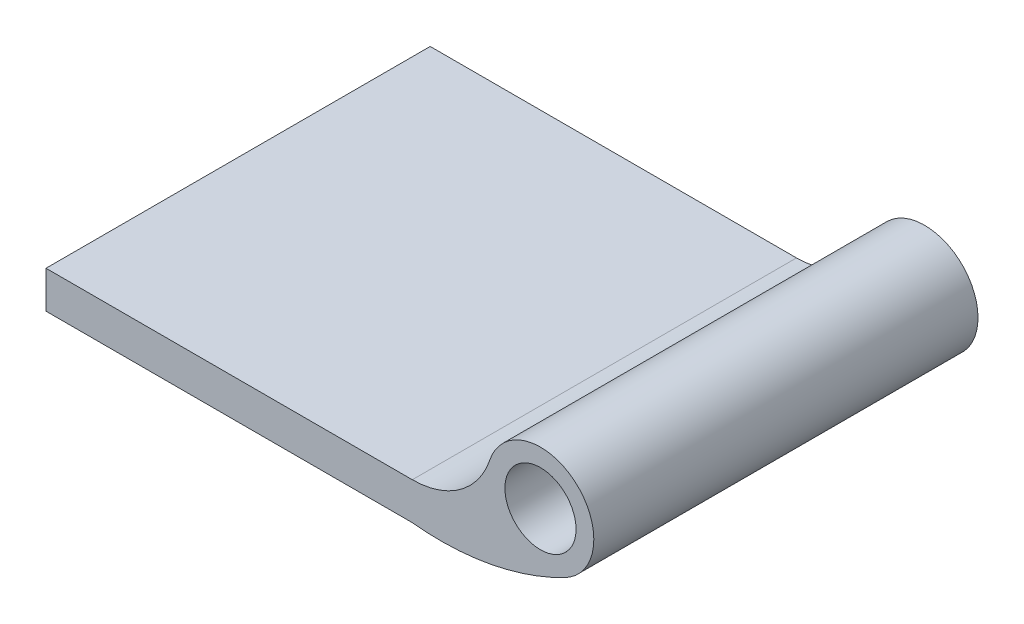
ISO-10303-21;
HEADER;
FILE_DESCRIPTION(('STEP AP214'),'2;1');
FILE_NAME('part.step','',(''),(''),'','','');
FILE_SCHEMA(('AUTOMOTIVE_DESIGN { 1 0 10303 214 1 1 1 1 }'));
ENDSEC;
DATA;
#1=APPLICATION_CONTEXT('core data for automotive mechanical design processes');
#2=APPLICATION_PROTOCOL_DEFINITION('international standard','automotive_design',2000,#1);
#3=PRODUCT_CONTEXT('',#1,'mechanical');
#4=PRODUCT('Part','Part','',(#3));
#5=PRODUCT_RELATED_PRODUCT_CATEGORY('part','',(#4));
#6=PRODUCT_DEFINITION_FORMATION('','',#4);
#7=PRODUCT_DEFINITION_CONTEXT('part definition',#1,'design');
#8=PRODUCT_DEFINITION('design','',#6,#7);
#9=PRODUCT_DEFINITION_SHAPE('','',#8);
#10=(LENGTH_UNIT() NAMED_UNIT(*) SI_UNIT(.MILLI.,.METRE.));
#11=(NAMED_UNIT(*) PLANE_ANGLE_UNIT() SI_UNIT($,.RADIAN.));
#12=(NAMED_UNIT(*) SI_UNIT($,.STERADIAN.) SOLID_ANGLE_UNIT());
#13=UNCERTAINTY_MEASURE_WITH_UNIT(LENGTH_MEASURE(1.E-05),#10,'distance_accuracy_value','');
#14=(GEOMETRIC_REPRESENTATION_CONTEXT(3) GLOBAL_UNCERTAINTY_ASSIGNED_CONTEXT((#13)) GLOBAL_UNIT_ASSIGNED_CONTEXT((#10,
#11,#12)) REPRESENTATION_CONTEXT('',''));
#15=CARTESIAN_POINT('',(0.,0.,0.));
#16=DIRECTION('',(0.,0.,1.));
#17=DIRECTION('',(1.,0.,0.));
#18=AXIS2_PLACEMENT_3D('',#15,#16,#17);
#19=CARTESIAN_POINT('',(0.,-21.4207725533601,108.));
#20=DIRECTION('',(0.,1.,0.));
#21=DIRECTION('',(0.,0.,1.));
#22=AXIS2_PLACEMENT_3D('',#19,#20,#21);
#23=PLANE('',#22);
#24=DIRECTION('',(1.,0.,0.));
#25=VECTOR('',#24,1.);
#26=CARTESIAN_POINT('',(0.,-21.4207725533601,0.));
#27=LINE('',#26,#25);
#28=CARTESIAN_POINT('',(-139.,-21.4207725533601,0.));
#29=VERTEX_POINT('',#28);
#30=CARTESIAN_POINT('',(-36.026336114154,-21.4207725533601,0.));
#31=VERTEX_POINT('',#30);
#32=EDGE_CURVE('E121',#29,#31,#27,.T.);
#33=ORIENTED_EDGE('',*,*,#32,.T.);
#34=DIRECTION('',(0.,0.,-1.));
#35=VECTOR('',#34,1.);
#36=CARTESIAN_POINT('',(-36.026336114154,-21.4207725533601,108.));
#37=LINE('',#36,#35);
#38=CARTESIAN_POINT('',(-36.026336114154,-21.4207725533601,108.));
#39=VERTEX_POINT('',#38);
#40=EDGE_CURVE('E11',#39,#31,#37,.T.);
#41=ORIENTED_EDGE('',*,*,#40,.F.);
#42=DIRECTION('',(1.,0.,0.));
#43=VECTOR('',#42,1.);
#44=CARTESIAN_POINT('',(0.,-21.4207725533601,108.));
#45=LINE('',#44,#43);
#46=CARTESIAN_POINT('',(-139.,-21.4207725533601,108.));
#47=VERTEX_POINT('',#46);
#48=EDGE_CURVE('E81',#47,#39,#45,.T.);
#49=ORIENTED_EDGE('',*,*,#48,.F.);
#50=DIRECTION('',(0.,0.,-1.));
#51=VECTOR('',#50,1.);
#52=CARTESIAN_POINT('',(-139.,-21.4207725533601,108.));
#53=LINE('',#52,#51);
#54=EDGE_CURVE('E50',#47,#29,#53,.T.);
#55=ORIENTED_EDGE('',*,*,#54,.T.);
#56=EDGE_LOOP('',(#33,#41,#49,#55));
#57=FACE_BOUND('',#56,.T.);
#58=ADVANCED_FACE('F34',(#57),#23,.F.);
#59=CARTESIAN_POINT('',(-28.0230008473586,53.9438078672115,108.));
#60=DIRECTION('',(0.,0.,-1.));
#61=DIRECTION('',(-1.,0.,0.));
#62=AXIS2_PLACEMENT_3D('',#59,#60,#61);
#63=CYLINDRICAL_SURFACE('',#62,75.7883457885283);
#64=CARTESIAN_POINT('',(-28.0230008473586,53.9438078672115,0.));
#65=DIRECTION('',(0.,0.,1.));
#66=DIRECTION('',(1.,0.,0.));
#67=AXIS2_PLACEMENT_3D('',#64,#65,#66);
#68=CIRCLE('',#67,75.7883457885283);
#69=CARTESIAN_POINT('',(6.91489474269762,-13.3110567085192,0.));
#70=VERTEX_POINT('',#69);
#71=EDGE_CURVE('E123',#70,#31,#68,.F.);
#72=ORIENTED_EDGE('',*,*,#71,.F.);
#73=DIRECTION('',(0.,0.,-1.));
#74=VECTOR('',#73,1.);
#75=CARTESIAN_POINT('',(6.91489474269762,-13.3110567085192,108.));
#76=LINE('',#75,#74);
#77=CARTESIAN_POINT('',(6.91489474269762,-13.3110567085192,108.));
#78=VERTEX_POINT('',#77);
#79=EDGE_CURVE('E42',#78,#70,#76,.T.);
#80=ORIENTED_EDGE('',*,*,#79,.F.);
#81=CARTESIAN_POINT('',(-28.0230008473586,53.9438078672115,108.));
#82=DIRECTION('',(0.,0.,1.));
#83=DIRECTION('',(1.,0.,0.));
#84=AXIS2_PLACEMENT_3D('',#81,#82,#83);
#85=CIRCLE('',#84,75.7883457885283);
#86=EDGE_CURVE('E149',#78,#39,#85,.F.);
#87=ORIENTED_EDGE('',*,*,#86,.T.);
#88=ORIENTED_EDGE('',*,*,#40,.T.);
#89=EDGE_LOOP('',(#72,#80,#87,#88));
#90=FACE_BOUND('',#89,.T.);
#91=ADVANCED_FACE('F148',(#90),#63,.T.);
#92=CARTESIAN_POINT('',(0.,0.,108.));
#93=DIRECTION('',(0.,0.,-1.));
#94=DIRECTION('',(-1.,0.,0.));
#95=AXIS2_PLACEMENT_3D('',#92,#93,#94);
#96=CYLINDRICAL_SURFACE('',#95,15.);
#97=CARTESIAN_POINT('',(0.,0.,0.));
#98=DIRECTION('',(0.,0.,1.));
#99=DIRECTION('',(1.,0.,0.));
#100=AXIS2_PLACEMENT_3D('',#97,#98,#99);
#101=CIRCLE('',#100,15.);
#102=CARTESIAN_POINT('',(-14.229640925935,4.74524173451217,0.));
#103=VERTEX_POINT('',#102);
#104=EDGE_CURVE('E126',#70,#103,#101,.T.);
#105=ORIENTED_EDGE('',*,*,#104,.T.);
#106=DIRECTION('',(0.,0.,-1.));
#107=VECTOR('',#106,1.);
#108=CARTESIAN_POINT('',(-14.229640925935,4.74524173451217,108.));
#109=LINE('',#108,#107);
#110=CARTESIAN_POINT('',(-14.229640925935,4.74524173451217,108.));
#111=VERTEX_POINT('',#110);
#112=EDGE_CURVE('E110',#111,#103,#109,.T.);
#113=ORIENTED_EDGE('',*,*,#112,.F.);
#114=CARTESIAN_POINT('',(0.,0.,108.));
#115=DIRECTION('',(0.,0.,1.));
#116=DIRECTION('',(1.,0.,0.));
#117=AXIS2_PLACEMENT_3D('',#114,#115,#116);
#118=CIRCLE('',#117,15.);
#119=EDGE_CURVE('E98',#78,#111,#118,.T.);
#120=ORIENTED_EDGE('',*,*,#119,.F.);
#121=ORIENTED_EDGE('',*,*,#79,.T.);
#122=EDGE_LOOP('',(#105,#113,#120,#121));
#123=FACE_BOUND('',#122,.T.);
#124=ADVANCED_FACE('F141',(#123),#96,.T.);
#125=CARTESIAN_POINT('',(-36.026336114154,12.0139133910868,108.));
#126=DIRECTION('',(0.,0.,-1.));
#127=DIRECTION('',(-1.,0.,0.));
#128=AXIS2_PLACEMENT_3D('',#125,#126,#127);
#129=CYLINDRICAL_SURFACE('',#128,22.9767166666437);
#130=CARTESIAN_POINT('',(-36.026336114154,12.0139133910868,0.));
#131=DIRECTION('',(0.,0.,1.));
#132=DIRECTION('',(1.,0.,0.));
#133=AXIS2_PLACEMENT_3D('',#130,#131,#132);
#134=CIRCLE('',#133,22.9767166666437);
#135=CARTESIAN_POINT('',(-36.026336114154,-10.9628032755569,0.));
#136=VERTEX_POINT('',#135);
#137=EDGE_CURVE('E107',#103,#136,#134,.F.);
#138=ORIENTED_EDGE('',*,*,#137,.T.);
#139=DIRECTION('',(0.,0.,-1.));
#140=VECTOR('',#139,1.);
#141=CARTESIAN_POINT('',(-36.026336114154,-10.9628032755569,108.));
#142=LINE('',#141,#140);
#143=CARTESIAN_POINT('',(-36.026336114154,-10.9628032755569,108.));
#144=VERTEX_POINT('',#143);
#145=EDGE_CURVE('E104',#144,#136,#142,.T.);
#146=ORIENTED_EDGE('',*,*,#145,.F.);
#147=CARTESIAN_POINT('',(-36.026336114154,12.0139133910868,108.));
#148=DIRECTION('',(0.,0.,1.));
#149=DIRECTION('',(1.,0.,0.));
#150=AXIS2_PLACEMENT_3D('',#147,#148,#149);
#151=CIRCLE('',#150,22.9767166666437);
#152=EDGE_CURVE('E91',#111,#144,#151,.F.);
#153=ORIENTED_EDGE('',*,*,#152,.F.);
#154=ORIENTED_EDGE('',*,*,#112,.T.);
#155=EDGE_LOOP('',(#138,#146,#153,#154));
#156=FACE_BOUND('',#155,.T.);
#157=ADVANCED_FACE('F105',(#156),#129,.F.);
#158=CARTESIAN_POINT('',(0.,-10.9628032755569,108.));
#159=DIRECTION('',(0.,1.,0.));
#160=DIRECTION('',(-1.,0.,0.));
#161=AXIS2_PLACEMENT_3D('',#158,#159,#160);
#162=PLANE('',#161);
#163=DIRECTION('',(1.,0.,0.));
#164=VECTOR('',#163,1.);
#165=CARTESIAN_POINT('',(0.,-10.9628032755569,0.));
#166=LINE('',#165,#164);
#167=CARTESIAN_POINT('',(-139.,-10.9628032755569,0.));
#168=VERTEX_POINT('',#167);
#169=EDGE_CURVE('E129',#168,#136,#166,.T.);
#170=ORIENTED_EDGE('',*,*,#169,.F.);
#171=DIRECTION('',(0.,0.,-1.));
#172=VECTOR('',#171,1.);
#173=CARTESIAN_POINT('',(-139.,-10.9628032755569,108.));
#174=LINE('',#173,#172);
#175=CARTESIAN_POINT('',(-139.,-10.9628032755569,108.));
#176=VERTEX_POINT('',#175);
#177=EDGE_CURVE('E69',#176,#168,#174,.T.);
#178=ORIENTED_EDGE('',*,*,#177,.F.);
#179=DIRECTION('',(1.,0.,0.));
#180=VECTOR('',#179,1.);
#181=CARTESIAN_POINT('',(0.,-10.9628032755569,108.));
#182=LINE('',#181,#180);
#183=EDGE_CURVE('E96',#176,#144,#182,.T.);
#184=ORIENTED_EDGE('',*,*,#183,.T.);
#185=ORIENTED_EDGE('',*,*,#145,.T.);
#186=EDGE_LOOP('',(#170,#178,#184,#185));
#187=FACE_BOUND('',#186,.T.);
#188=ADVANCED_FACE('F112',(#187),#162,.T.);
#189=CARTESIAN_POINT('',(-139.,0.,108.));
#190=DIRECTION('',(-1.,0.,0.));
#191=DIRECTION('',(0.,0.,1.));
#192=AXIS2_PLACEMENT_3D('',#189,#190,#191);
#193=PLANE('',#192);
#194=DIRECTION('',(0.,1.,0.));
#195=VECTOR('',#194,1.);
#196=CARTESIAN_POINT('',(-139.,0.,0.));
#197=LINE('',#196,#195);
#198=EDGE_CURVE('E131',#29,#168,#197,.T.);
#199=ORIENTED_EDGE('',*,*,#198,.F.);
#200=ORIENTED_EDGE('',*,*,#54,.F.);
#201=DIRECTION('',(0.,1.,0.));
#202=VECTOR('',#201,1.);
#203=CARTESIAN_POINT('',(-139.,0.,108.));
#204=LINE('',#203,#202);
#205=EDGE_CURVE('E113',#47,#176,#204,.T.);
#206=ORIENTED_EDGE('',*,*,#205,.T.);
#207=ORIENTED_EDGE('',*,*,#177,.T.);
#208=EDGE_LOOP('',(#199,#200,#206,#207));
#209=FACE_BOUND('',#208,.T.);
#210=ADVANCED_FACE('F150',(#209),#193,.T.);
#211=CARTESIAN_POINT('',(0.,0.,108.));
#212=DIRECTION('',(0.,0.,-1.));
#213=DIRECTION('',(-1.,0.,0.));
#214=AXIS2_PLACEMENT_3D('',#211,#212,#213);
#215=CYLINDRICAL_SURFACE('',#214,10.);
#216=CARTESIAN_POINT('',(0.,0.,108.));
#217=DIRECTION('',(0.,0.,1.));
#218=DIRECTION('',(1.,0.,0.));
#219=AXIS2_PLACEMENT_3D('',#216,#217,#218);
#220=CIRCLE('',#219,10.);
#221=CARTESIAN_POINT('',(10.,0.,108.));
#222=VERTEX_POINT('',#221);
#223=EDGE_CURVE('E115',#222,#222,#220,.T.);
#224=ORIENTED_EDGE('',*,*,#223,.T.);
#225=EDGE_LOOP('',(#224));
#226=FACE_BOUND('',#225,.T.);
#227=CARTESIAN_POINT('',(0.,0.,0.));
#228=DIRECTION('',(0.,0.,1.));
#229=DIRECTION('',(1.,0.,0.));
#230=AXIS2_PLACEMENT_3D('',#227,#228,#229);
#231=CIRCLE('',#230,10.);
#232=CARTESIAN_POINT('',(10.,0.,0.));
#233=VERTEX_POINT('',#232);
#234=EDGE_CURVE('E134',#233,#233,#231,.T.);
#235=ORIENTED_EDGE('',*,*,#234,.F.);
#236=EDGE_LOOP('',(#235));
#237=FACE_BOUND('',#236,.T.);
#238=ADVANCED_FACE('F152',(#226,#237),#215,.F.);
#239=CARTESIAN_POINT('',(0.,0.,108.));
#240=DIRECTION('',(0.,0.,1.));
#241=DIRECTION('',(1.,0.,0.));
#242=AXIS2_PLACEMENT_3D('',#239,#240,#241);
#243=PLANE('',#242);
#244=ORIENTED_EDGE('',*,*,#48,.T.);
#245=ORIENTED_EDGE('',*,*,#86,.F.);
#246=ORIENTED_EDGE('',*,*,#119,.T.);
#247=ORIENTED_EDGE('',*,*,#152,.T.);
#248=ORIENTED_EDGE('',*,*,#183,.F.);
#249=ORIENTED_EDGE('',*,*,#205,.F.);
#250=EDGE_LOOP('',(#244,#245,#246,#247,#248,#249));
#251=FACE_BOUND('',#250,.T.);
#252=ORIENTED_EDGE('',*,*,#223,.F.);
#253=EDGE_LOOP('',(#252));
#254=FACE_BOUND('',#253,.T.);
#255=ADVANCED_FACE('F93',(#251,#254),#243,.T.);
#256=CARTESIAN_POINT('',(0.,0.,0.));
#257=DIRECTION('',(0.,0.,1.));
#258=DIRECTION('',(1.,0.,0.));
#259=AXIS2_PLACEMENT_3D('',#256,#257,#258);
#260=PLANE('',#259);
#261=ORIENTED_EDGE('',*,*,#32,.F.);
#262=ORIENTED_EDGE('',*,*,#198,.T.);
#263=ORIENTED_EDGE('',*,*,#169,.T.);
#264=ORIENTED_EDGE('',*,*,#137,.F.);
#265=ORIENTED_EDGE('',*,*,#104,.F.);
#266=ORIENTED_EDGE('',*,*,#71,.T.);
#267=EDGE_LOOP('',(#261,#262,#263,#264,#265,#266));
#268=FACE_BOUND('',#267,.T.);
#269=ORIENTED_EDGE('',*,*,#234,.T.);
#270=EDGE_LOOP('',(#269));
#271=FACE_BOUND('',#270,.T.);
#272=ADVANCED_FACE('F146',(#268,#271),#260,.F.);
#273=CLOSED_SHELL('',(#58,#91,#124,#157,#188,#210,#238,#255,#272));
#274=MANIFOLD_SOLID_BREP('B2',#273);
#275=ADVANCED_BREP_SHAPE_REPRESENTATION('',(#18,#274),#14);
#276=SHAPE_DEFINITION_REPRESENTATION(#9,#275);
ENDSEC;
END-ISO-10303-21;
